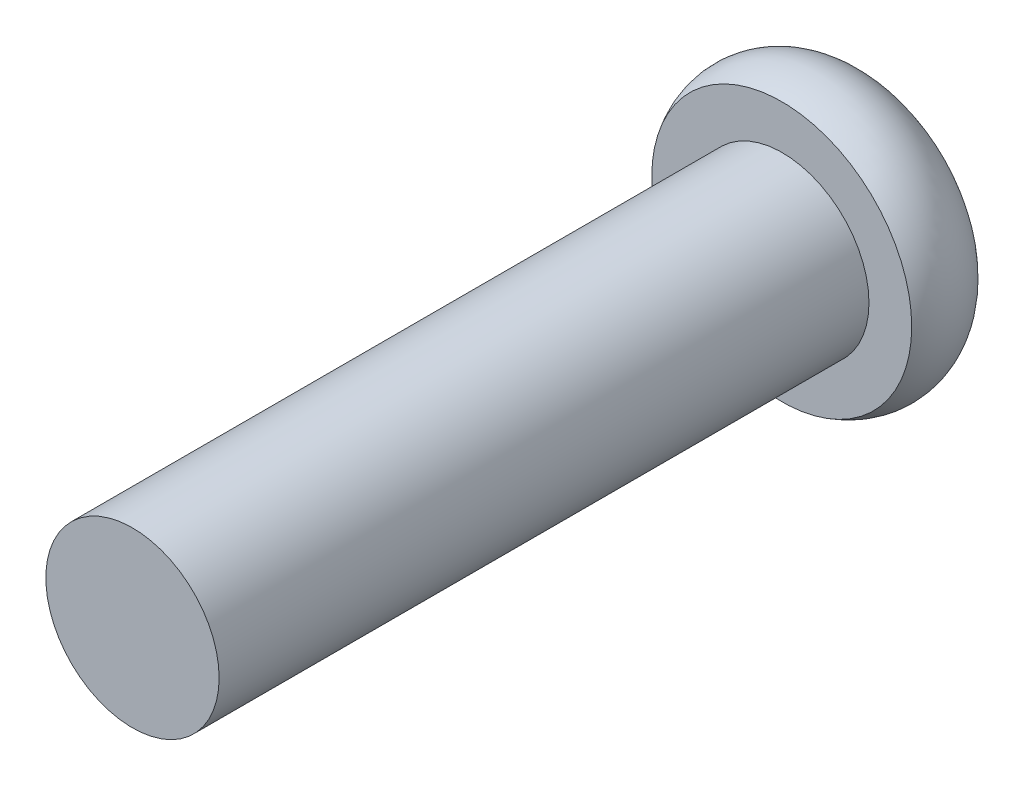
ISO-10303-21;
HEADER;
FILE_DESCRIPTION(('STEP AP214'),'2;1');
FILE_NAME('part.step','',(''),(''),'','','');
FILE_SCHEMA(('AUTOMOTIVE_DESIGN { 1 0 10303 214 1 1 1 1 }'));
ENDSEC;
DATA;
#1=APPLICATION_CONTEXT('core data for automotive mechanical design processes');
#2=APPLICATION_PROTOCOL_DEFINITION('international standard','automotive_design',2000,#1);
#3=PRODUCT_CONTEXT('',#1,'mechanical');
#4=PRODUCT('Part','Part','',(#3));
#5=PRODUCT_RELATED_PRODUCT_CATEGORY('part','',(#4));
#6=PRODUCT_DEFINITION_FORMATION('','',#4);
#7=PRODUCT_DEFINITION_CONTEXT('part definition',#1,'design');
#8=PRODUCT_DEFINITION('design','',#6,#7);
#9=PRODUCT_DEFINITION_SHAPE('','',#8);
#10=(LENGTH_UNIT() NAMED_UNIT(*) SI_UNIT(.MILLI.,.METRE.));
#11=(NAMED_UNIT(*) PLANE_ANGLE_UNIT() SI_UNIT($,.RADIAN.));
#12=(NAMED_UNIT(*) SI_UNIT($,.STERADIAN.) SOLID_ANGLE_UNIT());
#13=UNCERTAINTY_MEASURE_WITH_UNIT(LENGTH_MEASURE(1.E-05),#10,'distance_accuracy_value','');
#14=(GEOMETRIC_REPRESENTATION_CONTEXT(3) GLOBAL_UNCERTAINTY_ASSIGNED_CONTEXT((#13)) GLOBAL_UNIT_ASSIGNED_CONTEXT((#10,
#11,#12)) REPRESENTATION_CONTEXT('',''));
#15=CARTESIAN_POINT('',(0.,0.,0.));
#16=DIRECTION('',(0.,0.,1.));
#17=DIRECTION('',(1.,0.,0.));
#18=AXIS2_PLACEMENT_3D('',#15,#16,#17);
#19=CARTESIAN_POINT('',(0.,0.,0.));
#20=DIRECTION('',(0.,0.,1.));
#21=DIRECTION('',(1.,0.,0.));
#22=AXIS2_PLACEMENT_3D('',#19,#20,#21);
#23=PLANE('',#22);
#24=CARTESIAN_POINT('',(0.,0.,0.));
#25=DIRECTION('',(0.,0.,1.));
#26=DIRECTION('',(1.,0.,0.));
#27=AXIS2_PLACEMENT_3D('',#24,#25,#26);
#28=CIRCLE('',#27,3.);
#29=CARTESIAN_POINT('',(3.,0.,0.));
#30=VERTEX_POINT('',#29);
#31=EDGE_CURVE('E156',#30,#30,#28,.T.);
#32=ORIENTED_EDGE('',*,*,#31,.T.);
#33=EDGE_LOOP('',(#32));
#34=FACE_BOUND('',#33,.T.);
#35=CARTESIAN_POINT('',(0.0135896024399493,-0.0135896024399496,0.));
#36=DIRECTION('',(0.,0.,1.));
#37=DIRECTION('',(1.,0.,0.));
#38=AXIS2_PLACEMENT_3D('',#35,#36,#37);
#39=CIRCLE('',#38,2.);
#40=CARTESIAN_POINT('',(2.01358960243995,-0.0135896024399496,0.));
#41=VERTEX_POINT('',#40);
#42=EDGE_CURVE('E184',#41,#41,#39,.T.);
#43=ORIENTED_EDGE('',*,*,#42,.F.);
#44=EDGE_LOOP('',(#43));
#45=FACE_BOUND('',#44,.T.);
#46=ADVANCED_FACE('F35',(#34,#45),#23,.T.);
#47=CARTESIAN_POINT('',(0.,0.,-2.));
#48=DIRECTION('',(0.,0.,-1.));
#49=DIRECTION('',(-1.,0.,0.));
#50=AXIS2_PLACEMENT_3D('',#47,#48,#49);
#51=PLANE('',#50);
#52=DIRECTION('',(0.,1.,0.));
#53=VECTOR('',#52,1.);
#54=CARTESIAN_POINT('',(-0.5,-0.5,-2.));
#55=LINE('',#54,#53);
#56=CARTESIAN_POINT('',(-0.5,-2.,-2.));
#57=VERTEX_POINT('',#56);
#58=CARTESIAN_POINT('',(-0.5,-0.5,-2.));
#59=VERTEX_POINT('',#58);
#60=EDGE_CURVE('E49',#57,#59,#55,.T.);
#61=ORIENTED_EDGE('',*,*,#60,.F.);
#62=DIRECTION('',(-1.,0.,0.));
#63=VECTOR('',#62,1.);
#64=CARTESIAN_POINT('',(0.5,-2.,-2.));
#65=LINE('',#64,#63);
#66=CARTESIAN_POINT('',(0.5,-2.,-2.));
#67=VERTEX_POINT('',#66);
#68=EDGE_CURVE('E152',#67,#57,#65,.T.);
#69=ORIENTED_EDGE('',*,*,#68,.F.);
#70=DIRECTION('',(0.,-1.,0.));
#71=VECTOR('',#70,1.);
#72=CARTESIAN_POINT('',(0.5,-0.5,-2.));
#73=LINE('',#72,#71);
#74=CARTESIAN_POINT('',(0.5,-0.5,-2.));
#75=VERTEX_POINT('',#74);
#76=EDGE_CURVE('E216',#75,#67,#73,.T.);
#77=ORIENTED_EDGE('',*,*,#76,.F.);
#78=DIRECTION('',(-1.,0.,0.));
#79=VECTOR('',#78,1.);
#80=CARTESIAN_POINT('',(2.,-0.5,-2.));
#81=LINE('',#80,#79);
#82=CARTESIAN_POINT('',(2.,-0.5,-2.));
#83=VERTEX_POINT('',#82);
#84=EDGE_CURVE('E213',#83,#75,#81,.T.);
#85=ORIENTED_EDGE('',*,*,#84,.F.);
#86=DIRECTION('',(0.,-1.,0.));
#87=VECTOR('',#86,1.);
#88=CARTESIAN_POINT('',(2.,0.5,-2.));
#89=LINE('',#88,#87);
#90=CARTESIAN_POINT('',(2.,0.5,-2.));
#91=VERTEX_POINT('',#90);
#92=EDGE_CURVE('E210',#91,#83,#89,.T.);
#93=ORIENTED_EDGE('',*,*,#92,.F.);
#94=DIRECTION('',(1.,0.,0.));
#95=VECTOR('',#94,1.);
#96=CARTESIAN_POINT('',(2.,0.5,-2.));
#97=LINE('',#96,#95);
#98=CARTESIAN_POINT('',(0.5,0.5,-2.));
#99=VERTEX_POINT('',#98);
#100=EDGE_CURVE('E207',#99,#91,#97,.T.);
#101=ORIENTED_EDGE('',*,*,#100,.F.);
#102=DIRECTION('',(0.,-1.,0.));
#103=VECTOR('',#102,1.);
#104=CARTESIAN_POINT('',(0.5,2.,-2.));
#105=LINE('',#104,#103);
#106=CARTESIAN_POINT('',(0.5,2.,-2.));
#107=VERTEX_POINT('',#106);
#108=EDGE_CURVE('E204',#107,#99,#105,.T.);
#109=ORIENTED_EDGE('',*,*,#108,.F.);
#110=DIRECTION('',(1.,0.,0.));
#111=VECTOR('',#110,1.);
#112=CARTESIAN_POINT('',(0.5,2.,-2.));
#113=LINE('',#112,#111);
#114=CARTESIAN_POINT('',(-0.5,2.,-2.));
#115=VERTEX_POINT('',#114);
#116=EDGE_CURVE('E201',#115,#107,#113,.T.);
#117=ORIENTED_EDGE('',*,*,#116,.F.);
#118=DIRECTION('',(0.,1.,0.));
#119=VECTOR('',#118,1.);
#120=CARTESIAN_POINT('',(-0.5,2.,-2.));
#121=LINE('',#120,#119);
#122=CARTESIAN_POINT('',(-0.5,0.5,-2.));
#123=VERTEX_POINT('',#122);
#124=EDGE_CURVE('E198',#123,#115,#121,.T.);
#125=ORIENTED_EDGE('',*,*,#124,.F.);
#126=DIRECTION('',(1.,0.,0.));
#127=VECTOR('',#126,1.);
#128=CARTESIAN_POINT('',(-0.5,0.5,-2.));
#129=LINE('',#128,#127);
#130=CARTESIAN_POINT('',(-2.,0.5,-2.));
#131=VERTEX_POINT('',#130);
#132=EDGE_CURVE('E195',#131,#123,#129,.T.);
#133=ORIENTED_EDGE('',*,*,#132,.F.);
#134=DIRECTION('',(0.,1.,0.));
#135=VECTOR('',#134,1.);
#136=CARTESIAN_POINT('',(-2.,0.5,-2.));
#137=LINE('',#136,#135);
#138=CARTESIAN_POINT('',(-2.,-0.5,-2.));
#139=VERTEX_POINT('',#138);
#140=EDGE_CURVE('E193',#139,#131,#137,.T.);
#141=ORIENTED_EDGE('',*,*,#140,.F.);
#142=DIRECTION('',(-1.,0.,0.));
#143=VECTOR('',#142,1.);
#144=CARTESIAN_POINT('',(-0.5,-0.5,-2.));
#145=LINE('',#144,#143);
#146=EDGE_CURVE('E134',#59,#139,#145,.T.);
#147=ORIENTED_EDGE('',*,*,#146,.F.);
#148=EDGE_LOOP('',(#61,#69,#77,#85,#93,#101,#109,#117,#125,#133,#141,#147));
#149=FACE_BOUND('',#148,.T.);
#150=CARTESIAN_POINT('',(0.,0.,-2.));
#151=DIRECTION('',(0.,0.,1.));
#152=DIRECTION('',(1.,0.,0.));
#153=AXIS2_PLACEMENT_3D('',#150,#151,#152);
#154=CIRCLE('',#153,2.29828566126008);
#155=CARTESIAN_POINT('',(2.29828566126008,0.,-2.));
#156=VERTEX_POINT('',#155);
#157=EDGE_CURVE('E11',#156,#156,#154,.T.);
#158=ORIENTED_EDGE('',*,*,#157,.F.);
#159=EDGE_LOOP('',(#158));
#160=FACE_BOUND('',#159,.T.);
#161=ADVANCED_FACE('F166',(#149,#160),#51,.T.);
#162=CARTESIAN_POINT('',(0.,0.,-1.5));
#163=DIRECTION('',(0.,0.,1.));
#164=DIRECTION('',(1.,0.,0.));
#165=AXIS2_PLACEMENT_3D('',#162,#163,#164);
#166=TOROIDAL_SURFACE('',#165,2.29828566126008,0.5);
#167=ORIENTED_EDGE('',*,*,#157,.T.);
#168=EDGE_LOOP('',(#167));
#169=FACE_BOUND('',#168,.T.);
#170=CARTESIAN_POINT('',(0.,0.,-1.91742578561798));
#171=DIRECTION('',(0.,0.,1.));
#172=DIRECTION('',(1.,0.,0.));
#173=AXIS2_PLACEMENT_3D('',#170,#171,#172);
#174=CIRCLE('',#173,2.5735232195642);
#175=CARTESIAN_POINT('',(2.5735232195642,0.,-1.91742578561798));
#176=VERTEX_POINT('',#175);
#177=EDGE_CURVE('E42',#176,#176,#174,.T.);
#178=ORIENTED_EDGE('',*,*,#177,.F.);
#179=EDGE_LOOP('',(#178));
#180=FACE_BOUND('',#179,.T.);
#181=ADVANCED_FACE('F164',(#169,#180),#166,.T.);
#182=CARTESIAN_POINT('',(0.,0.,-0.738365689933416));
#183=DIRECTION('',(0.,0.,1.));
#184=DIRECTION('',(1.,0.,0.));
#185=AXIS2_PLACEMENT_3D('',#182,#183,#184);
#186=TOROIDAL_SURFACE('',#185,1.79608772561263,1.41229906765225);
#187=ORIENTED_EDGE('',*,*,#177,.T.);
#188=EDGE_LOOP('',(#187));
#189=FACE_BOUND('',#188,.T.);
#190=ORIENTED_EDGE('',*,*,#31,.F.);
#191=EDGE_LOOP('',(#190));
#192=FACE_BOUND('',#191,.T.);
#193=ADVANCED_FACE('F161',(#189,#192),#186,.T.);
#194=CARTESIAN_POINT('',(-0.5,-0.5,-2.));
#195=DIRECTION('',(-0.978147600733806,0.,0.20791169081776));
#196=DIRECTION('',(0.20791169081776,0.,0.978147600733806));
#197=AXIS2_PLACEMENT_3D('',#194,#195,#196);
#198=PLANE('',#197);
#199=ORIENTED_EDGE('',*,*,#60,.T.);
#200=DIRECTION('',(-0.203558594952779,-0.203558594952779,-0.957667894857973));
#201=VECTOR('',#200,1.);
#202=CARTESIAN_POINT('',(-0.5,-0.5,-2.));
#203=LINE('',#202,#201);
#204=CARTESIAN_POINT('',(-0.0748868766599549,-0.074886876659955,0.));
#205=VERTEX_POINT('',#204);
#206=EDGE_CURVE('E89',#205,#59,#203,.T.);
#207=ORIENTED_EDGE('',*,*,#206,.F.);
#208=DIRECTION('',(0.,1.,0.));
#209=VECTOR('',#208,1.);
#210=CARTESIAN_POINT('',(-0.0748868766599548,0.,0.));
#211=LINE('',#210,#209);
#212=CARTESIAN_POINT('',(-0.0748868766599552,-1.57488687665996,0.));
#213=VERTEX_POINT('',#212);
#214=EDGE_CURVE('E150',#213,#205,#211,.T.);
#215=ORIENTED_EDGE('',*,*,#214,.F.);
#216=DIRECTION('',(-0.203558594952779,-0.203558594952779,-0.957667894857973));
#217=VECTOR('',#216,1.);
#218=CARTESIAN_POINT('',(-0.45856389842085,-1.95856389842085,-1.80505846889133));
#219=LINE('',#218,#217);
#220=EDGE_CURVE('E57',#213,#57,#219,.T.);
#221=ORIENTED_EDGE('',*,*,#220,.T.);
#222=EDGE_LOOP('',(#199,#207,#215,#221));
#223=FACE_BOUND('',#222,.T.);
#224=ADVANCED_FACE('F173',(#223),#198,.F.);
#225=CARTESIAN_POINT('',(0.5,-2.,-2.));
#226=DIRECTION('',(0.,-0.978147600733806,0.20791169081776));
#227=DIRECTION('',(0.,-0.20791169081776,-0.978147600733806));
#228=AXIS2_PLACEMENT_3D('',#225,#226,#227);
#229=PLANE('',#228);
#230=ORIENTED_EDGE('',*,*,#68,.T.);
#231=ORIENTED_EDGE('',*,*,#220,.F.);
#232=DIRECTION('',(-1.,0.,0.));
#233=VECTOR('',#232,1.);
#234=CARTESIAN_POINT('',(0.,-1.57488687665995,0.));
#235=LINE('',#234,#233);
#236=CARTESIAN_POINT('',(0.0748868766599548,-1.57488687665996,0.));
#237=VERTEX_POINT('',#236);
#238=EDGE_CURVE('E220',#237,#213,#235,.T.);
#239=ORIENTED_EDGE('',*,*,#238,.F.);
#240=DIRECTION('',(0.203558594952779,-0.203558594952779,-0.957667894857973));
#241=VECTOR('',#240,1.);
#242=CARTESIAN_POINT('',(0.437845847631275,-1.93784584763128,-1.70758770333699));
#243=LINE('',#242,#241);
#244=EDGE_CURVE('E94',#237,#67,#243,.T.);
#245=ORIENTED_EDGE('',*,*,#244,.T.);
#246=EDGE_LOOP('',(#230,#231,#239,#245));
#247=FACE_BOUND('',#246,.T.);
#248=ADVANCED_FACE('F291',(#247),#229,.F.);
#249=CARTESIAN_POINT('',(0.5,-0.5,-2.));
#250=DIRECTION('',(0.978147600733806,0.,0.20791169081776));
#251=DIRECTION('',(0.20791169081776,0.,-0.978147600733806));
#252=AXIS2_PLACEMENT_3D('',#249,#250,#251);
#253=PLANE('',#252);
#254=ORIENTED_EDGE('',*,*,#76,.T.);
#255=ORIENTED_EDGE('',*,*,#244,.F.);
#256=DIRECTION('',(0.,-1.,0.));
#257=VECTOR('',#256,1.);
#258=CARTESIAN_POINT('',(0.0748868766599551,0.,0.));
#259=LINE('',#258,#257);
#260=CARTESIAN_POINT('',(0.0748868766599551,-0.074886876659955,0.));
#261=VERTEX_POINT('',#260);
#262=EDGE_CURVE('E239',#261,#237,#259,.T.);
#263=ORIENTED_EDGE('',*,*,#262,.F.);
#264=DIRECTION('',(0.203558594952779,-0.203558594952779,-0.957667894857973));
#265=VECTOR('',#264,1.);
#266=CARTESIAN_POINT('',(0.5,-0.5,-2.));
#267=LINE('',#266,#265);
#268=EDGE_CURVE('E235',#261,#75,#267,.T.);
#269=ORIENTED_EDGE('',*,*,#268,.T.);
#270=EDGE_LOOP('',(#254,#255,#263,#269));
#271=FACE_BOUND('',#270,.T.);
#272=ADVANCED_FACE('F289',(#271),#253,.F.);
#273=CARTESIAN_POINT('',(2.,-0.5,-2.));
#274=DIRECTION('',(0.,-0.978147600733806,0.20791169081776));
#275=DIRECTION('',(0.,-0.20791169081776,-0.978147600733806));
#276=AXIS2_PLACEMENT_3D('',#273,#274,#275);
#277=PLANE('',#276);
#278=ORIENTED_EDGE('',*,*,#84,.T.);
#279=ORIENTED_EDGE('',*,*,#268,.F.);
#280=DIRECTION('',(-1.,0.,0.));
#281=VECTOR('',#280,1.);
#282=CARTESIAN_POINT('',(0.,-0.0748868766599549,0.));
#283=LINE('',#282,#281);
#284=CARTESIAN_POINT('',(1.57488687665996,-0.074886876659955,0.));
#285=VERTEX_POINT('',#284);
#286=EDGE_CURVE('E242',#285,#261,#283,.T.);
#287=ORIENTED_EDGE('',*,*,#286,.F.);
#288=DIRECTION('',(0.203558594952779,-0.203558594952779,-0.957667894857973));
#289=VECTOR('',#288,1.);
#290=CARTESIAN_POINT('',(1.95856389842085,-0.45856389842085,-1.80505846889133));
#291=LINE('',#290,#289);
#292=EDGE_CURVE('E233',#285,#83,#291,.T.);
#293=ORIENTED_EDGE('',*,*,#292,.T.);
#294=EDGE_LOOP('',(#278,#279,#287,#293));
#295=FACE_BOUND('',#294,.T.);
#296=ADVANCED_FACE('F285',(#295),#277,.F.);
#297=CARTESIAN_POINT('',(2.,0.5,-2.));
#298=DIRECTION('',(0.978147600733806,0.,0.20791169081776));
#299=DIRECTION('',(0.20791169081776,0.,-0.978147600733806));
#300=AXIS2_PLACEMENT_3D('',#297,#298,#299);
#301=PLANE('',#300);
#302=ORIENTED_EDGE('',*,*,#92,.T.);
#303=ORIENTED_EDGE('',*,*,#292,.F.);
#304=DIRECTION('',(0.,-1.,0.));
#305=VECTOR('',#304,1.);
#306=CARTESIAN_POINT('',(1.57488687665995,0.,0.));
#307=LINE('',#306,#305);
#308=CARTESIAN_POINT('',(1.57488687665996,0.0748868766599549,0.));
#309=VERTEX_POINT('',#308);
#310=EDGE_CURVE('E245',#309,#285,#307,.T.);
#311=ORIENTED_EDGE('',*,*,#310,.F.);
#312=DIRECTION('',(0.203558594952779,0.203558594952779,-0.957667894857973));
#313=VECTOR('',#312,1.);
#314=CARTESIAN_POINT('',(2.,0.5,-2.));
#315=LINE('',#314,#313);
#316=EDGE_CURVE('E231',#309,#91,#315,.T.);
#317=ORIENTED_EDGE('',*,*,#316,.T.);
#318=EDGE_LOOP('',(#302,#303,#311,#317));
#319=FACE_BOUND('',#318,.T.);
#320=ADVANCED_FACE('F281',(#319),#301,.F.);
#321=CARTESIAN_POINT('',(2.,0.5,-2.));
#322=DIRECTION('',(0.,0.978147600733805,0.20791169081776));
#323=DIRECTION('',(0.,-0.20791169081776,0.978147600733806));
#324=AXIS2_PLACEMENT_3D('',#321,#322,#323);
#325=PLANE('',#324);
#326=ORIENTED_EDGE('',*,*,#100,.T.);
#327=ORIENTED_EDGE('',*,*,#316,.F.);
#328=DIRECTION('',(1.,0.,0.));
#329=VECTOR('',#328,1.);
#330=CARTESIAN_POINT('',(0.,0.074886876659955,0.));
#331=LINE('',#330,#329);
#332=CARTESIAN_POINT('',(0.0748868766599547,0.0748868766599549,0.));
#333=VERTEX_POINT('',#332);
#334=EDGE_CURVE('E248',#333,#309,#331,.T.);
#335=ORIENTED_EDGE('',*,*,#334,.F.);
#336=DIRECTION('',(0.203558594952779,0.203558594952779,-0.957667894857973));
#337=VECTOR('',#336,1.);
#338=CARTESIAN_POINT('',(0.562154152368724,0.562154152368725,-2.29241229666301));
#339=LINE('',#338,#337);
#340=EDGE_CURVE('E229',#333,#99,#339,.T.);
#341=ORIENTED_EDGE('',*,*,#340,.T.);
#342=EDGE_LOOP('',(#326,#327,#335,#341));
#343=FACE_BOUND('',#342,.T.);
#344=ADVANCED_FACE('F277',(#343),#325,.F.);
#345=CARTESIAN_POINT('',(0.5,2.,-2.));
#346=DIRECTION('',(0.978147600733806,0.,0.20791169081776));
#347=DIRECTION('',(0.20791169081776,0.,-0.978147600733806));
#348=AXIS2_PLACEMENT_3D('',#345,#346,#347);
#349=PLANE('',#348);
#350=ORIENTED_EDGE('',*,*,#108,.T.);
#351=ORIENTED_EDGE('',*,*,#340,.F.);
#352=DIRECTION('',(0.,-1.,0.));
#353=VECTOR('',#352,1.);
#354=CARTESIAN_POINT('',(0.0748868766599546,0.,0.));
#355=LINE('',#354,#353);
#356=CARTESIAN_POINT('',(0.0748868766599549,1.57488687665996,0.));
#357=VERTEX_POINT('',#356);
#358=EDGE_CURVE('E251',#357,#333,#355,.T.);
#359=ORIENTED_EDGE('',*,*,#358,.F.);
#360=DIRECTION('',(0.203558594952779,0.203558594952779,-0.957667894857973));
#361=VECTOR('',#360,1.);
#362=CARTESIAN_POINT('',(0.5,2.,-2.));
#363=LINE('',#362,#361);
#364=EDGE_CURVE('E227',#357,#107,#363,.T.);
#365=ORIENTED_EDGE('',*,*,#364,.T.);
#366=EDGE_LOOP('',(#350,#351,#359,#365));
#367=FACE_BOUND('',#366,.T.);
#368=ADVANCED_FACE('F273',(#367),#349,.F.);
#369=CARTESIAN_POINT('',(0.5,2.,-2.));
#370=DIRECTION('',(0.,0.978147600733806,0.20791169081776));
#371=DIRECTION('',(0.,-0.20791169081776,0.978147600733806));
#372=AXIS2_PLACEMENT_3D('',#369,#370,#371);
#373=PLANE('',#372);
#374=ORIENTED_EDGE('',*,*,#116,.T.);
#375=ORIENTED_EDGE('',*,*,#364,.F.);
#376=DIRECTION('',(1.,0.,0.));
#377=VECTOR('',#376,1.);
#378=CARTESIAN_POINT('',(0.,1.57488687665995,0.));
#379=LINE('',#378,#377);
#380=CARTESIAN_POINT('',(-0.0748868766599548,1.57488687665996,0.));
#381=VERTEX_POINT('',#380);
#382=EDGE_CURVE('E254',#381,#357,#379,.T.);
#383=ORIENTED_EDGE('',*,*,#382,.F.);
#384=DIRECTION('',(-0.203558594952779,0.203558594952779,-0.957667894857973));
#385=VECTOR('',#384,1.);
#386=CARTESIAN_POINT('',(-0.5,2.,-2.));
#387=LINE('',#386,#385);
#388=EDGE_CURVE('E225',#381,#115,#387,.T.);
#389=ORIENTED_EDGE('',*,*,#388,.T.);
#390=EDGE_LOOP('',(#374,#375,#383,#389));
#391=FACE_BOUND('',#390,.T.);
#392=ADVANCED_FACE('F269',(#391),#373,.F.);
#393=CARTESIAN_POINT('',(-0.5,2.,-2.));
#394=DIRECTION('',(-0.978147600733806,0.,0.20791169081776));
#395=DIRECTION('',(0.20791169081776,0.,0.978147600733806));
#396=AXIS2_PLACEMENT_3D('',#393,#394,#395);
#397=PLANE('',#396);
#398=ORIENTED_EDGE('',*,*,#124,.T.);
#399=ORIENTED_EDGE('',*,*,#388,.F.);
#400=DIRECTION('',(0.,1.,0.));
#401=VECTOR('',#400,1.);
#402=CARTESIAN_POINT('',(-0.0748868766599548,0.,0.));
#403=LINE('',#402,#401);
#404=CARTESIAN_POINT('',(-0.0748868766599549,0.074886876659955,0.));
#405=VERTEX_POINT('',#404);
#406=EDGE_CURVE('E257',#405,#381,#403,.T.);
#407=ORIENTED_EDGE('',*,*,#406,.F.);
#408=DIRECTION('',(-0.203558594952779,0.203558594952779,-0.957667894857973));
#409=VECTOR('',#408,1.);
#410=CARTESIAN_POINT('',(-0.562154152368724,0.562154152368725,-2.29241229666301));
#411=LINE('',#410,#409);
#412=EDGE_CURVE('E223',#405,#123,#411,.T.);
#413=ORIENTED_EDGE('',*,*,#412,.T.);
#414=EDGE_LOOP('',(#398,#399,#407,#413));
#415=FACE_BOUND('',#414,.T.);
#416=ADVANCED_FACE('F265',(#415),#397,.F.);
#417=CARTESIAN_POINT('',(-0.5,0.5,-2.));
#418=DIRECTION('',(0.,0.978147600733806,0.20791169081776));
#419=DIRECTION('',(0.,-0.20791169081776,0.978147600733806));
#420=AXIS2_PLACEMENT_3D('',#417,#418,#419);
#421=PLANE('',#420);
#422=ORIENTED_EDGE('',*,*,#132,.T.);
#423=ORIENTED_EDGE('',*,*,#412,.F.);
#424=DIRECTION('',(1.,0.,0.));
#425=VECTOR('',#424,1.);
#426=CARTESIAN_POINT('',(0.,0.0748868766599549,0.));
#427=LINE('',#426,#425);
#428=CARTESIAN_POINT('',(-1.57488687665996,0.074886876659955,0.));
#429=VERTEX_POINT('',#428);
#430=EDGE_CURVE('E146',#429,#405,#427,.T.);
#431=ORIENTED_EDGE('',*,*,#430,.F.);
#432=DIRECTION('',(-0.203558594952779,0.203558594952779,-0.957667894857973));
#433=VECTOR('',#432,1.);
#434=CARTESIAN_POINT('',(-2.,0.5,-2.));
#435=LINE('',#434,#433);
#436=EDGE_CURVE('E138',#429,#131,#435,.T.);
#437=ORIENTED_EDGE('',*,*,#436,.T.);
#438=EDGE_LOOP('',(#422,#423,#431,#437));
#439=FACE_BOUND('',#438,.T.);
#440=ADVANCED_FACE('F261',(#439),#421,.F.);
#441=CARTESIAN_POINT('',(-2.,0.5,-2.));
#442=DIRECTION('',(-0.978147600733806,0.,0.20791169081776));
#443=DIRECTION('',(0.20791169081776,0.,0.978147600733806));
#444=AXIS2_PLACEMENT_3D('',#441,#442,#443);
#445=PLANE('',#444);
#446=ORIENTED_EDGE('',*,*,#140,.T.);
#447=ORIENTED_EDGE('',*,*,#436,.F.);
#448=DIRECTION('',(0.,1.,0.));
#449=VECTOR('',#448,1.);
#450=CARTESIAN_POINT('',(-1.57488687665995,0.,0.));
#451=LINE('',#450,#449);
#452=CARTESIAN_POINT('',(-1.57488687665995,-0.074886876659955,0.));
#453=VERTEX_POINT('',#452);
#454=EDGE_CURVE('E141',#453,#429,#451,.T.);
#455=ORIENTED_EDGE('',*,*,#454,.F.);
#456=DIRECTION('',(-0.203558594952779,-0.203558594952779,-0.957667894857973));
#457=VECTOR('',#456,1.);
#458=CARTESIAN_POINT('',(-1.93784584763128,-0.437845847631276,-1.70758770333699));
#459=LINE('',#458,#457);
#460=EDGE_CURVE('E127',#453,#139,#459,.T.);
#461=ORIENTED_EDGE('',*,*,#460,.T.);
#462=EDGE_LOOP('',(#446,#447,#455,#461));
#463=FACE_BOUND('',#462,.T.);
#464=ADVANCED_FACE('F142',(#463),#445,.F.);
#465=CARTESIAN_POINT('',(-0.5,-0.5,-2.));
#466=DIRECTION('',(0.,-0.978147600733806,0.20791169081776));
#467=DIRECTION('',(0.,-0.20791169081776,-0.978147600733806));
#468=AXIS2_PLACEMENT_3D('',#465,#466,#467);
#469=PLANE('',#468);
#470=ORIENTED_EDGE('',*,*,#146,.T.);
#471=ORIENTED_EDGE('',*,*,#460,.F.);
#472=DIRECTION('',(-1.,0.,0.));
#473=VECTOR('',#472,1.);
#474=CARTESIAN_POINT('',(0.,-0.0748868766599549,0.));
#475=LINE('',#474,#473);
#476=EDGE_CURVE('E131',#205,#453,#475,.T.);
#477=ORIENTED_EDGE('',*,*,#476,.F.);
#478=ORIENTED_EDGE('',*,*,#206,.T.);
#479=EDGE_LOOP('',(#470,#471,#477,#478));
#480=FACE_BOUND('',#479,.T.);
#481=ADVANCED_FACE('F129',(#480),#469,.F.);
#482=CARTESIAN_POINT('',(0.0135896024399493,-0.0135896024399496,0.));
#483=DIRECTION('',(0.,0.,1.));
#484=DIRECTION('',(1.,0.,0.));
#485=AXIS2_PLACEMENT_3D('',#482,#483,#484);
#486=PLANE('',#485);
#487=ORIENTED_EDGE('',*,*,#238,.T.);
#488=ORIENTED_EDGE('',*,*,#214,.T.);
#489=ORIENTED_EDGE('',*,*,#476,.T.);
#490=ORIENTED_EDGE('',*,*,#454,.T.);
#491=ORIENTED_EDGE('',*,*,#430,.T.);
#492=ORIENTED_EDGE('',*,*,#406,.T.);
#493=ORIENTED_EDGE('',*,*,#382,.T.);
#494=ORIENTED_EDGE('',*,*,#358,.T.);
#495=ORIENTED_EDGE('',*,*,#334,.T.);
#496=ORIENTED_EDGE('',*,*,#310,.T.);
#497=ORIENTED_EDGE('',*,*,#286,.T.);
#498=ORIENTED_EDGE('',*,*,#262,.T.);
#499=EDGE_LOOP('',(#487,#488,#489,#490,#491,#492,#493,#494,#495,#496,#497,#498));
#500=FACE_BOUND('',#499,.T.);
#501=ADVANCED_FACE('F149',(#500),#486,.F.);
#502=CARTESIAN_POINT('',(0.0135896024399493,-0.0135896024399496,15.));
#503=DIRECTION('',(0.,0.,-1.));
#504=DIRECTION('',(-1.,0.,0.));
#505=AXIS2_PLACEMENT_3D('',#502,#503,#504);
#506=CYLINDRICAL_SURFACE('',#505,2.);
#507=CARTESIAN_POINT('',(0.0135896024399493,-0.0135896024399496,15.));
#508=DIRECTION('',(0.,0.,1.));
#509=DIRECTION('',(1.,0.,0.));
#510=AXIS2_PLACEMENT_3D('',#507,#508,#509);
#511=CIRCLE('',#510,2.);
#512=CARTESIAN_POINT('',(2.01358960243995,-0.0135896024399496,15.));
#513=VERTEX_POINT('',#512);
#514=EDGE_CURVE('E186',#513,#513,#511,.T.);
#515=ORIENTED_EDGE('',*,*,#514,.F.);
#516=EDGE_LOOP('',(#515));
#517=FACE_BOUND('',#516,.T.);
#518=ORIENTED_EDGE('',*,*,#42,.T.);
#519=EDGE_LOOP('',(#518));
#520=FACE_BOUND('',#519,.T.);
#521=ADVANCED_FACE('F319',(#517,#520),#506,.T.);
#522=CARTESIAN_POINT('',(0.0135896024399493,-0.0135896024399496,15.));
#523=DIRECTION('',(0.,0.,1.));
#524=DIRECTION('',(1.,0.,0.));
#525=AXIS2_PLACEMENT_3D('',#522,#523,#524);
#526=PLANE('',#525);
#527=ORIENTED_EDGE('',*,*,#514,.T.);
#528=EDGE_LOOP('',(#527));
#529=FACE_BOUND('',#528,.T.);
#530=ADVANCED_FACE('F322',(#529),#526,.T.);
#531=CLOSED_SHELL('',(#46,#161,#181,#193,#224,#248,#272,#296,#320,#344,#368,#392,#416,#440,#464,
#481,#501,#521,#530));
#532=MANIFOLD_SOLID_BREP('B2',#531);
#533=ADVANCED_BREP_SHAPE_REPRESENTATION('',(#18,#532),#14);
#534=SHAPE_DEFINITION_REPRESENTATION(#9,#533);
ENDSEC;
END-ISO-10303-21;
